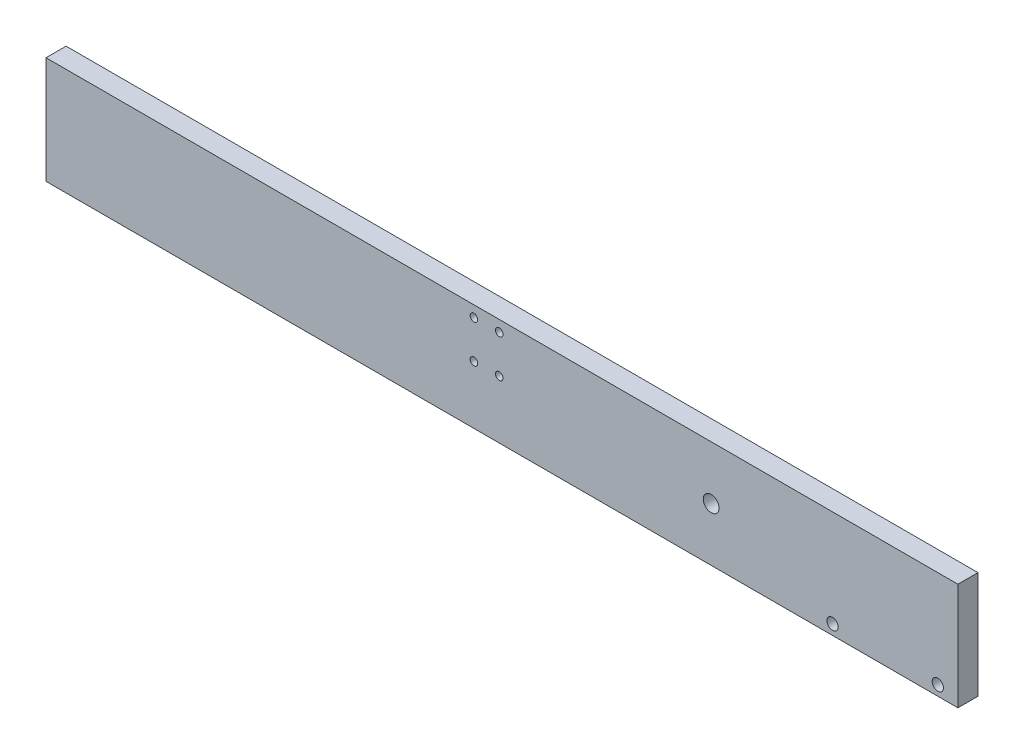
ISO-10303-21;
HEADER;
FILE_DESCRIPTION(('STEP AP214'),'2;1');
FILE_NAME('part.step','',(''),(''),'','','');
FILE_SCHEMA(('AUTOMOTIVE_DESIGN { 1 0 10303 214 1 1 1 1 }'));
ENDSEC;
DATA;
#1=APPLICATION_CONTEXT('core data for automotive mechanical design processes');
#2=APPLICATION_PROTOCOL_DEFINITION('international standard','automotive_design',2000,#1);
#3=PRODUCT_CONTEXT('',#1,'mechanical');
#4=PRODUCT('Part','Part','',(#3));
#5=PRODUCT_RELATED_PRODUCT_CATEGORY('part','',(#4));
#6=PRODUCT_DEFINITION_FORMATION('','',#4);
#7=PRODUCT_DEFINITION_CONTEXT('part definition',#1,'design');
#8=PRODUCT_DEFINITION('design','',#6,#7);
#9=PRODUCT_DEFINITION_SHAPE('','',#8);
#10=(LENGTH_UNIT() NAMED_UNIT(*) SI_UNIT(.MILLI.,.METRE.));
#11=(NAMED_UNIT(*) PLANE_ANGLE_UNIT() SI_UNIT($,.RADIAN.));
#12=(NAMED_UNIT(*) SI_UNIT($,.STERADIAN.) SOLID_ANGLE_UNIT());
#13=UNCERTAINTY_MEASURE_WITH_UNIT(LENGTH_MEASURE(1.E-05),#10,'distance_accuracy_value','');
#14=(GEOMETRIC_REPRESENTATION_CONTEXT(3) GLOBAL_UNCERTAINTY_ASSIGNED_CONTEXT((#13)) GLOBAL_UNIT_ASSIGNED_CONTEXT((#10,
#11,#12)) REPRESENTATION_CONTEXT('',''));
#15=CARTESIAN_POINT('',(0.,0.,0.));
#16=DIRECTION('',(0.,0.,1.));
#17=DIRECTION('',(1.,0.,0.));
#18=AXIS2_PLACEMENT_3D('',#15,#16,#17);
#19=CARTESIAN_POINT('',(0.,0.,6.35));
#20=DIRECTION('',(0.,0.,1.));
#21=DIRECTION('',(1.,0.,0.));
#22=AXIS2_PLACEMENT_3D('',#19,#20,#21);
#23=PLANE('',#22);
#24=CARTESIAN_POINT('',(281.94,3.17500000000001,6.35));
#25=DIRECTION('',(0.,0.,1.));
#26=DIRECTION('',(1.,0.,0.));
#27=AXIS2_PLACEMENT_3D('',#24,#25,#26);
#28=CIRCLE('',#27,1.78593750000004);
#29=CARTESIAN_POINT('',(283.7259375,3.17500000000001,6.35));
#30=VERTEX_POINT('',#29);
#31=EDGE_CURVE('E166',#30,#30,#28,.T.);
#32=ORIENTED_EDGE('',*,*,#31,.F.);
#33=EDGE_LOOP('',(#32));
#34=FACE_BOUND('',#33,.T.);
#35=CARTESIAN_POINT('',(143.29,18.35,6.35));
#36=DIRECTION('',(0.,0.,1.));
#37=DIRECTION('',(1.,0.,0.));
#38=AXIS2_PLACEMENT_3D('',#35,#36,#37);
#39=CIRCLE('',#38,1.19999999999999);
#40=CARTESIAN_POINT('',(144.49,18.35,6.35));
#41=VERTEX_POINT('',#40);
#42=EDGE_CURVE('E150',#41,#41,#39,.T.);
#43=ORIENTED_EDGE('',*,*,#42,.F.);
#44=EDGE_LOOP('',(#43));
#45=FACE_BOUND('',#44,.T.);
#46=CARTESIAN_POINT('',(135.29,30.35,6.35));
#47=DIRECTION('',(0.,0.,1.));
#48=DIRECTION('',(1.,0.,0.));
#49=AXIS2_PLACEMENT_3D('',#46,#47,#48);
#50=CIRCLE('',#49,1.20000000000002);
#51=CARTESIAN_POINT('',(136.49,30.35,6.35));
#52=VERTEX_POINT('',#51);
#53=EDGE_CURVE('E134',#52,#52,#50,.T.);
#54=ORIENTED_EDGE('',*,*,#53,.F.);
#55=EDGE_LOOP('',(#54));
#56=FACE_BOUND('',#55,.T.);
#57=DIRECTION('',(-1.,0.,0.));
#58=VECTOR('',#57,1.);
#59=CARTESIAN_POINT('',(288.29,33.85,6.35));
#60=LINE('',#59,#58);
#61=CARTESIAN_POINT('',(288.29,33.85,6.35));
#62=VERTEX_POINT('',#61);
#63=CARTESIAN_POINT('',(0.,33.85,6.35));
#64=VERTEX_POINT('',#63);
#65=EDGE_CURVE('E92',#62,#64,#60,.T.);
#66=ORIENTED_EDGE('',*,*,#65,.T.);
#67=DIRECTION('',(0.,-1.,0.));
#68=VECTOR('',#67,1.);
#69=CARTESIAN_POINT('',(0.,33.85,6.35));
#70=LINE('',#69,#68);
#71=CARTESIAN_POINT('',(0.,0.,6.35));
#72=VERTEX_POINT('',#71);
#73=EDGE_CURVE('E87',#64,#72,#70,.T.);
#74=ORIENTED_EDGE('',*,*,#73,.T.);
#75=DIRECTION('',(1.,0.,0.));
#76=VECTOR('',#75,1.);
#77=CARTESIAN_POINT('',(0.,0.,6.35));
#78=LINE('',#77,#76);
#79=CARTESIAN_POINT('',(288.29,0.,6.35));
#80=VERTEX_POINT('',#79);
#81=EDGE_CURVE('E90',#72,#80,#78,.T.);
#82=ORIENTED_EDGE('',*,*,#81,.T.);
#83=DIRECTION('',(0.,1.,0.));
#84=VECTOR('',#83,1.);
#85=CARTESIAN_POINT('',(288.29,0.,6.35));
#86=LINE('',#85,#84);
#87=EDGE_CURVE('E57',#80,#62,#86,.T.);
#88=ORIENTED_EDGE('',*,*,#87,.T.);
#89=EDGE_LOOP('',(#66,#74,#82,#88));
#90=FACE_BOUND('',#89,.T.);
#91=CARTESIAN_POINT('',(210.29,16.925,6.35));
#92=DIRECTION('',(0.,0.,1.));
#93=DIRECTION('',(1.,0.,0.));
#94=AXIS2_PLACEMENT_3D('',#91,#92,#93);
#95=CIRCLE('',#94,2.49999999999999);
#96=CARTESIAN_POINT('',(212.79,16.925,6.35));
#97=VERTEX_POINT('',#96);
#98=EDGE_CURVE('E112',#97,#97,#95,.T.);
#99=ORIENTED_EDGE('',*,*,#98,.F.);
#100=EDGE_LOOP('',(#99));
#101=FACE_BOUND('',#100,.T.);
#102=CARTESIAN_POINT('',(135.29,18.35,6.35));
#103=DIRECTION('',(0.,0.,1.));
#104=DIRECTION('',(1.,0.,0.));
#105=AXIS2_PLACEMENT_3D('',#102,#103,#104);
#106=CIRCLE('',#105,1.20000000000002);
#107=CARTESIAN_POINT('',(136.49,18.35,6.35));
#108=VERTEX_POINT('',#107);
#109=EDGE_CURVE('E142',#108,#108,#106,.T.);
#110=ORIENTED_EDGE('',*,*,#109,.F.);
#111=EDGE_LOOP('',(#110));
#112=FACE_BOUND('',#111,.T.);
#113=CARTESIAN_POINT('',(143.29,30.35,6.35));
#114=DIRECTION('',(0.,0.,1.));
#115=DIRECTION('',(1.,0.,0.));
#116=AXIS2_PLACEMENT_3D('',#113,#114,#115);
#117=CIRCLE('',#116,1.19999999999999);
#118=CARTESIAN_POINT('',(144.49,30.35,6.35));
#119=VERTEX_POINT('',#118);
#120=EDGE_CURVE('E158',#119,#119,#117,.T.);
#121=ORIENTED_EDGE('',*,*,#120,.F.);
#122=EDGE_LOOP('',(#121));
#123=FACE_BOUND('',#122,.T.);
#124=CARTESIAN_POINT('',(248.64,3.17500000000001,6.35));
#125=DIRECTION('',(0.,0.,1.));
#126=DIRECTION('',(1.,0.,0.));
#127=AXIS2_PLACEMENT_3D('',#124,#125,#126);
#128=CIRCLE('',#127,1.78593750000002);
#129=CARTESIAN_POINT('',(250.4259375,3.17500000000001,6.35));
#130=VERTEX_POINT('',#129);
#131=EDGE_CURVE('E174',#130,#130,#128,.T.);
#132=ORIENTED_EDGE('',*,*,#131,.F.);
#133=EDGE_LOOP('',(#132));
#134=FACE_BOUND('',#133,.T.);
#135=ADVANCED_FACE('F39',(#34,#45,#56,#90,#101,#112,#123,#134),#23,.T.);
#136=CARTESIAN_POINT('',(0.,0.,0.));
#137=DIRECTION('',(0.,0.,1.));
#138=DIRECTION('',(1.,0.,0.));
#139=AXIS2_PLACEMENT_3D('',#136,#137,#138);
#140=PLANE('',#139);
#141=DIRECTION('',(-1.,0.,0.));
#142=VECTOR('',#141,1.);
#143=CARTESIAN_POINT('',(288.29,33.85,0.));
#144=LINE('',#143,#142);
#145=CARTESIAN_POINT('',(288.29,33.85,0.));
#146=VERTEX_POINT('',#145);
#147=CARTESIAN_POINT('',(0.,33.85,0.));
#148=VERTEX_POINT('',#147);
#149=EDGE_CURVE('E108',#146,#148,#144,.T.);
#150=ORIENTED_EDGE('',*,*,#149,.F.);
#151=DIRECTION('',(0.,1.,0.));
#152=VECTOR('',#151,1.);
#153=CARTESIAN_POINT('',(288.29,0.,0.));
#154=LINE('',#153,#152);
#155=CARTESIAN_POINT('',(288.29,0.,0.));
#156=VERTEX_POINT('',#155);
#157=EDGE_CURVE('E80',#156,#146,#154,.T.);
#158=ORIENTED_EDGE('',*,*,#157,.F.);
#159=DIRECTION('',(1.,0.,0.));
#160=VECTOR('',#159,1.);
#161=CARTESIAN_POINT('',(0.,0.,0.));
#162=LINE('',#161,#160);
#163=CARTESIAN_POINT('',(0.,0.,0.));
#164=VERTEX_POINT('',#163);
#165=EDGE_CURVE('E74',#164,#156,#162,.T.);
#166=ORIENTED_EDGE('',*,*,#165,.F.);
#167=DIRECTION('',(0.,-1.,0.));
#168=VECTOR('',#167,1.);
#169=CARTESIAN_POINT('',(0.,33.85,0.));
#170=LINE('',#169,#168);
#171=EDGE_CURVE('E97',#148,#164,#170,.T.);
#172=ORIENTED_EDGE('',*,*,#171,.F.);
#173=EDGE_LOOP('',(#150,#158,#166,#172));
#174=FACE_BOUND('',#173,.T.);
#175=CARTESIAN_POINT('',(210.29,16.925,0.));
#176=DIRECTION('',(0.,0.,1.));
#177=DIRECTION('',(1.,0.,0.));
#178=AXIS2_PLACEMENT_3D('',#175,#176,#177);
#179=CIRCLE('',#178,2.49999999999999);
#180=CARTESIAN_POINT('',(212.79,16.925,0.));
#181=VERTEX_POINT('',#180);
#182=EDGE_CURVE('E130',#181,#181,#179,.T.);
#183=ORIENTED_EDGE('',*,*,#182,.T.);
#184=EDGE_LOOP('',(#183));
#185=FACE_BOUND('',#184,.T.);
#186=CARTESIAN_POINT('',(135.29,30.35,0.));
#187=DIRECTION('',(0.,0.,1.));
#188=DIRECTION('',(1.,0.,0.));
#189=AXIS2_PLACEMENT_3D('',#186,#187,#188);
#190=CIRCLE('',#189,1.20000000000002);
#191=CARTESIAN_POINT('',(136.49,30.35,0.));
#192=VERTEX_POINT('',#191);
#193=EDGE_CURVE('E138',#192,#192,#190,.T.);
#194=ORIENTED_EDGE('',*,*,#193,.T.);
#195=EDGE_LOOP('',(#194));
#196=FACE_BOUND('',#195,.T.);
#197=CARTESIAN_POINT('',(135.29,18.35,0.));
#198=DIRECTION('',(0.,0.,1.));
#199=DIRECTION('',(1.,0.,0.));
#200=AXIS2_PLACEMENT_3D('',#197,#198,#199);
#201=CIRCLE('',#200,1.20000000000002);
#202=CARTESIAN_POINT('',(136.49,18.35,0.));
#203=VERTEX_POINT('',#202);
#204=EDGE_CURVE('E146',#203,#203,#201,.T.);
#205=ORIENTED_EDGE('',*,*,#204,.T.);
#206=EDGE_LOOP('',(#205));
#207=FACE_BOUND('',#206,.T.);
#208=CARTESIAN_POINT('',(143.29,18.35,0.));
#209=DIRECTION('',(0.,0.,1.));
#210=DIRECTION('',(1.,0.,0.));
#211=AXIS2_PLACEMENT_3D('',#208,#209,#210);
#212=CIRCLE('',#211,1.19999999999999);
#213=CARTESIAN_POINT('',(144.49,18.35,0.));
#214=VERTEX_POINT('',#213);
#215=EDGE_CURVE('E154',#214,#214,#212,.T.);
#216=ORIENTED_EDGE('',*,*,#215,.T.);
#217=EDGE_LOOP('',(#216));
#218=FACE_BOUND('',#217,.T.);
#219=CARTESIAN_POINT('',(143.29,30.35,0.));
#220=DIRECTION('',(0.,0.,1.));
#221=DIRECTION('',(1.,0.,0.));
#222=AXIS2_PLACEMENT_3D('',#219,#220,#221);
#223=CIRCLE('',#222,1.19999999999999);
#224=CARTESIAN_POINT('',(144.49,30.35,0.));
#225=VERTEX_POINT('',#224);
#226=EDGE_CURVE('E162',#225,#225,#223,.T.);
#227=ORIENTED_EDGE('',*,*,#226,.T.);
#228=EDGE_LOOP('',(#227));
#229=FACE_BOUND('',#228,.T.);
#230=CARTESIAN_POINT('',(281.94,3.17500000000001,0.));
#231=DIRECTION('',(0.,0.,1.));
#232=DIRECTION('',(1.,0.,0.));
#233=AXIS2_PLACEMENT_3D('',#230,#231,#232);
#234=CIRCLE('',#233,1.78593750000004);
#235=CARTESIAN_POINT('',(283.7259375,3.17500000000001,0.));
#236=VERTEX_POINT('',#235);
#237=EDGE_CURVE('E170',#236,#236,#234,.T.);
#238=ORIENTED_EDGE('',*,*,#237,.T.);
#239=EDGE_LOOP('',(#238));
#240=FACE_BOUND('',#239,.T.);
#241=CARTESIAN_POINT('',(248.64,3.17500000000001,0.));
#242=DIRECTION('',(0.,0.,1.));
#243=DIRECTION('',(1.,0.,0.));
#244=AXIS2_PLACEMENT_3D('',#241,#242,#243);
#245=CIRCLE('',#244,1.78593750000002);
#246=CARTESIAN_POINT('',(250.4259375,3.17500000000001,0.));
#247=VERTEX_POINT('',#246);
#248=EDGE_CURVE('E178',#247,#247,#245,.T.);
#249=ORIENTED_EDGE('',*,*,#248,.T.);
#250=EDGE_LOOP('',(#249));
#251=FACE_BOUND('',#250,.T.);
#252=ADVANCED_FACE('F125',(#174,#185,#196,#207,#218,#229,#240,#251),#140,.F.);
#253=CARTESIAN_POINT('',(288.29,33.85,6.35));
#254=DIRECTION('',(0.,-1.,0.));
#255=DIRECTION('',(0.,0.,-1.));
#256=AXIS2_PLACEMENT_3D('',#253,#254,#255);
#257=PLANE('',#256);
#258=ORIENTED_EDGE('',*,*,#149,.T.);
#259=DIRECTION('',(0.,0.,-1.));
#260=VECTOR('',#259,1.);
#261=CARTESIAN_POINT('',(0.,33.85,6.35));
#262=LINE('',#261,#260);
#263=EDGE_CURVE('E11',#64,#148,#262,.T.);
#264=ORIENTED_EDGE('',*,*,#263,.F.);
#265=ORIENTED_EDGE('',*,*,#65,.F.);
#266=DIRECTION('',(0.,0.,-1.));
#267=VECTOR('',#266,1.);
#268=CARTESIAN_POINT('',(288.29,33.85,6.35));
#269=LINE('',#268,#267);
#270=EDGE_CURVE('E104',#62,#146,#269,.T.);
#271=ORIENTED_EDGE('',*,*,#270,.T.);
#272=EDGE_LOOP('',(#258,#264,#265,#271));
#273=FACE_BOUND('',#272,.T.);
#274=ADVANCED_FACE('F41',(#273),#257,.F.);
#275=CARTESIAN_POINT('',(0.,33.85,6.35));
#276=DIRECTION('',(1.,0.,0.));
#277=DIRECTION('',(0.,0.,-1.));
#278=AXIS2_PLACEMENT_3D('',#275,#276,#277);
#279=PLANE('',#278);
#280=ORIENTED_EDGE('',*,*,#171,.T.);
#281=DIRECTION('',(0.,0.,-1.));
#282=VECTOR('',#281,1.);
#283=CARTESIAN_POINT('',(0.,0.,6.35));
#284=LINE('',#283,#282);
#285=EDGE_CURVE('E49',#72,#164,#284,.T.);
#286=ORIENTED_EDGE('',*,*,#285,.F.);
#287=ORIENTED_EDGE('',*,*,#73,.F.);
#288=ORIENTED_EDGE('',*,*,#263,.T.);
#289=EDGE_LOOP('',(#280,#286,#287,#288));
#290=FACE_BOUND('',#289,.T.);
#291=ADVANCED_FACE('F96',(#290),#279,.F.);
#292=CARTESIAN_POINT('',(0.,0.,6.35));
#293=DIRECTION('',(0.,1.,0.));
#294=DIRECTION('',(-1.,0.,0.));
#295=AXIS2_PLACEMENT_3D('',#292,#293,#294);
#296=PLANE('',#295);
#297=ORIENTED_EDGE('',*,*,#165,.T.);
#298=DIRECTION('',(0.,0.,-1.));
#299=VECTOR('',#298,1.);
#300=CARTESIAN_POINT('',(288.29,0.,6.35));
#301=LINE('',#300,#299);
#302=EDGE_CURVE('E99',#80,#156,#301,.T.);
#303=ORIENTED_EDGE('',*,*,#302,.F.);
#304=ORIENTED_EDGE('',*,*,#81,.F.);
#305=ORIENTED_EDGE('',*,*,#285,.T.);
#306=EDGE_LOOP('',(#297,#303,#304,#305));
#307=FACE_BOUND('',#306,.T.);
#308=ADVANCED_FACE('F100',(#307),#296,.F.);
#309=CARTESIAN_POINT('',(288.29,0.,6.35));
#310=DIRECTION('',(-1.,0.,0.));
#311=DIRECTION('',(0.,0.,1.));
#312=AXIS2_PLACEMENT_3D('',#309,#310,#311);
#313=PLANE('',#312);
#314=ORIENTED_EDGE('',*,*,#157,.T.);
#315=ORIENTED_EDGE('',*,*,#270,.F.);
#316=ORIENTED_EDGE('',*,*,#87,.F.);
#317=ORIENTED_EDGE('',*,*,#302,.T.);
#318=EDGE_LOOP('',(#314,#315,#316,#317));
#319=FACE_BOUND('',#318,.T.);
#320=ADVANCED_FACE('F122',(#319),#313,.F.);
#321=CARTESIAN_POINT('',(210.29,16.925,6.35));
#322=DIRECTION('',(0.,0.,-1.));
#323=DIRECTION('',(-1.,0.,0.));
#324=AXIS2_PLACEMENT_3D('',#321,#322,#323);
#325=CYLINDRICAL_SURFACE('',#324,2.49999999999999);
#326=ORIENTED_EDGE('',*,*,#98,.T.);
#327=EDGE_LOOP('',(#326));
#328=FACE_BOUND('',#327,.T.);
#329=ORIENTED_EDGE('',*,*,#182,.F.);
#330=EDGE_LOOP('',(#329));
#331=FACE_BOUND('',#330,.T.);
#332=ADVANCED_FACE('F199',(#328,#331),#325,.F.);
#333=CARTESIAN_POINT('',(135.29,30.35,6.35));
#334=DIRECTION('',(0.,0.,-1.));
#335=DIRECTION('',(-1.,0.,0.));
#336=AXIS2_PLACEMENT_3D('',#333,#334,#335);
#337=CYLINDRICAL_SURFACE('',#336,1.20000000000002);
#338=ORIENTED_EDGE('',*,*,#53,.T.);
#339=EDGE_LOOP('',(#338));
#340=FACE_BOUND('',#339,.T.);
#341=ORIENTED_EDGE('',*,*,#193,.F.);
#342=EDGE_LOOP('',(#341));
#343=FACE_BOUND('',#342,.T.);
#344=ADVANCED_FACE('F245',(#340,#343),#337,.F.);
#345=CARTESIAN_POINT('',(135.29,18.35,6.35));
#346=DIRECTION('',(0.,0.,-1.));
#347=DIRECTION('',(-1.,0.,0.));
#348=AXIS2_PLACEMENT_3D('',#345,#346,#347);
#349=CYLINDRICAL_SURFACE('',#348,1.20000000000002);
#350=ORIENTED_EDGE('',*,*,#109,.T.);
#351=EDGE_LOOP('',(#350));
#352=FACE_BOUND('',#351,.T.);
#353=ORIENTED_EDGE('',*,*,#204,.F.);
#354=EDGE_LOOP('',(#353));
#355=FACE_BOUND('',#354,.T.);
#356=ADVANCED_FACE('F253',(#352,#355),#349,.F.);
#357=CARTESIAN_POINT('',(143.29,18.35,6.35));
#358=DIRECTION('',(0.,0.,-1.));
#359=DIRECTION('',(-1.,0.,0.));
#360=AXIS2_PLACEMENT_3D('',#357,#358,#359);
#361=CYLINDRICAL_SURFACE('',#360,1.19999999999999);
#362=ORIENTED_EDGE('',*,*,#42,.T.);
#363=EDGE_LOOP('',(#362));
#364=FACE_BOUND('',#363,.T.);
#365=ORIENTED_EDGE('',*,*,#215,.F.);
#366=EDGE_LOOP('',(#365));
#367=FACE_BOUND('',#366,.T.);
#368=ADVANCED_FACE('F261',(#364,#367),#361,.F.);
#369=CARTESIAN_POINT('',(143.29,30.35,6.35));
#370=DIRECTION('',(0.,0.,-1.));
#371=DIRECTION('',(-1.,0.,0.));
#372=AXIS2_PLACEMENT_3D('',#369,#370,#371);
#373=CYLINDRICAL_SURFACE('',#372,1.19999999999999);
#374=ORIENTED_EDGE('',*,*,#120,.T.);
#375=EDGE_LOOP('',(#374));
#376=FACE_BOUND('',#375,.T.);
#377=ORIENTED_EDGE('',*,*,#226,.F.);
#378=EDGE_LOOP('',(#377));
#379=FACE_BOUND('',#378,.T.);
#380=ADVANCED_FACE('F270',(#376,#379),#373,.F.);
#381=CARTESIAN_POINT('',(281.94,3.17500000000001,6.35));
#382=DIRECTION('',(0.,0.,-1.));
#383=DIRECTION('',(-1.,0.,0.));
#384=AXIS2_PLACEMENT_3D('',#381,#382,#383);
#385=CYLINDRICAL_SURFACE('',#384,1.78593750000004);
#386=ORIENTED_EDGE('',*,*,#31,.T.);
#387=EDGE_LOOP('',(#386));
#388=FACE_BOUND('',#387,.T.);
#389=ORIENTED_EDGE('',*,*,#237,.F.);
#390=EDGE_LOOP('',(#389));
#391=FACE_BOUND('',#390,.T.);
#392=ADVANCED_FACE('F279',(#388,#391),#385,.F.);
#393=CARTESIAN_POINT('',(248.64,3.17500000000001,6.35));
#394=DIRECTION('',(0.,0.,-1.));
#395=DIRECTION('',(-1.,0.,0.));
#396=AXIS2_PLACEMENT_3D('',#393,#394,#395);
#397=CYLINDRICAL_SURFACE('',#396,1.78593750000002);
#398=ORIENTED_EDGE('',*,*,#131,.T.);
#399=EDGE_LOOP('',(#398));
#400=FACE_BOUND('',#399,.T.);
#401=ORIENTED_EDGE('',*,*,#248,.F.);
#402=EDGE_LOOP('',(#401));
#403=FACE_BOUND('',#402,.T.);
#404=ADVANCED_FACE('F186',(#400,#403),#397,.F.);
#405=CLOSED_SHELL('',(#135,#252,#274,#291,#308,#320,#332,#344,#356,#368,#380,#392,#404));
#406=MANIFOLD_SOLID_BREP('B2',#405);
#407=ADVANCED_BREP_SHAPE_REPRESENTATION('',(#18,#406),#14);
#408=SHAPE_DEFINITION_REPRESENTATION(#9,#407);
ENDSEC;
END-ISO-10303-21;
